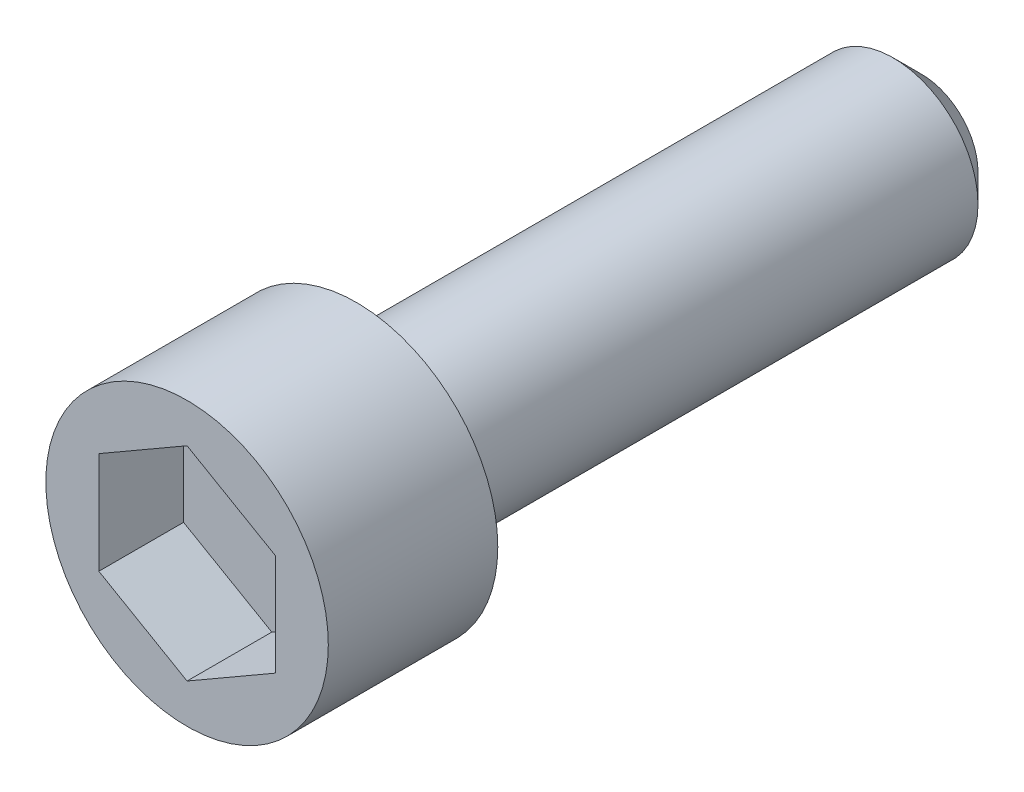
ISO-10303-21;
HEADER;
FILE_DESCRIPTION(('STEP AP214'),'2;1');
FILE_NAME('part.step','',(''),(''),'','','');
FILE_SCHEMA(('AUTOMOTIVE_DESIGN { 1 0 10303 214 1 1 1 1 }'));
ENDSEC;
DATA;
#1=APPLICATION_CONTEXT('core data for automotive mechanical design processes');
#2=APPLICATION_PROTOCOL_DEFINITION('international standard','automotive_design',2000,#1);
#3=PRODUCT_CONTEXT('',#1,'mechanical');
#4=PRODUCT('Part','Part','',(#3));
#5=PRODUCT_RELATED_PRODUCT_CATEGORY('part','',(#4));
#6=PRODUCT_DEFINITION_FORMATION('','',#4);
#7=PRODUCT_DEFINITION_CONTEXT('part definition',#1,'design');
#8=PRODUCT_DEFINITION('design','',#6,#7);
#9=PRODUCT_DEFINITION_SHAPE('','',#8);
#10=(LENGTH_UNIT() NAMED_UNIT(*) SI_UNIT(.MILLI.,.METRE.));
#11=(NAMED_UNIT(*) PLANE_ANGLE_UNIT() SI_UNIT($,.RADIAN.));
#12=(NAMED_UNIT(*) SI_UNIT($,.STERADIAN.) SOLID_ANGLE_UNIT());
#13=UNCERTAINTY_MEASURE_WITH_UNIT(LENGTH_MEASURE(1.E-05),#10,'distance_accuracy_value','');
#14=(GEOMETRIC_REPRESENTATION_CONTEXT(3) GLOBAL_UNCERTAINTY_ASSIGNED_CONTEXT((#13)) GLOBAL_UNIT_ASSIGNED_CONTEXT((#10,
#11,#12)) REPRESENTATION_CONTEXT('',''));
#15=CARTESIAN_POINT('',(0.,0.,0.));
#16=DIRECTION('',(0.,0.,1.));
#17=DIRECTION('',(1.,0.,0.));
#18=AXIS2_PLACEMENT_3D('',#15,#16,#17);
#19=CARTESIAN_POINT('',(0.,0.,10.));
#20=DIRECTION('',(0.,0.,-1.));
#21=DIRECTION('',(-1.,0.,0.));
#22=AXIS2_PLACEMENT_3D('',#19,#20,#21);
#23=CYLINDRICAL_SURFACE('',#22,1.5);
#24=CARTESIAN_POINT('',(0.,0.,0.500000000000002));
#25=DIRECTION('',(0.,0.,1.));
#26=DIRECTION('',(1.,0.,0.));
#27=AXIS2_PLACEMENT_3D('',#24,#25,#26);
#28=CIRCLE('',#27,1.5);
#29=CARTESIAN_POINT('',(1.5,0.,0.500000000000002));
#30=VERTEX_POINT('',#29);
#31=EDGE_CURVE('E44',#30,#30,#28,.T.);
#32=ORIENTED_EDGE('',*,*,#31,.T.);
#33=EDGE_LOOP('',(#32));
#34=FACE_BOUND('',#33,.T.);
#35=CARTESIAN_POINT('',(0.,0.,10.));
#36=DIRECTION('',(0.,0.,1.));
#37=DIRECTION('',(1.,0.,0.));
#38=AXIS2_PLACEMENT_3D('',#35,#36,#37);
#39=CIRCLE('',#38,1.5);
#40=CARTESIAN_POINT('',(1.5,0.,10.));
#41=VERTEX_POINT('',#40);
#42=EDGE_CURVE('E147',#41,#41,#39,.T.);
#43=ORIENTED_EDGE('',*,*,#42,.F.);
#44=EDGE_LOOP('',(#43));
#45=FACE_BOUND('',#44,.T.);
#46=ADVANCED_FACE('F36',(#34,#45),#23,.T.);
#47=CARTESIAN_POINT('',(0.,0.,0.));
#48=DIRECTION('',(0.,0.,1.));
#49=DIRECTION('',(1.,0.,0.));
#50=AXIS2_PLACEMENT_3D('',#47,#48,#49);
#51=PLANE('',#50);
#52=CARTESIAN_POINT('',(0.,0.,0.));
#53=DIRECTION('',(0.,0.,1.));
#54=DIRECTION('',(1.,0.,0.));
#55=AXIS2_PLACEMENT_3D('',#52,#53,#54);
#56=CIRCLE('',#55,0.999999999999999);
#57=CARTESIAN_POINT('',(0.999999999999999,0.,0.));
#58=VERTEX_POINT('',#57);
#59=EDGE_CURVE('E11',#58,#58,#56,.F.);
#60=ORIENTED_EDGE('',*,*,#59,.T.);
#61=EDGE_LOOP('',(#60));
#62=FACE_BOUND('',#61,.T.);
#63=ADVANCED_FACE('F165',(#62),#51,.F.);
#64=CARTESIAN_POINT('',(0.,0.,13.));
#65=DIRECTION('',(0.,0.,-1.));
#66=DIRECTION('',(-1.,0.,0.));
#67=AXIS2_PLACEMENT_3D('',#64,#65,#66);
#68=CYLINDRICAL_SURFACE('',#67,2.5);
#69=CARTESIAN_POINT('',(0.,0.,13.));
#70=DIRECTION('',(0.,0.,1.));
#71=DIRECTION('',(1.,0.,0.));
#72=AXIS2_PLACEMENT_3D('',#69,#70,#71);
#73=CIRCLE('',#72,2.5);
#74=CARTESIAN_POINT('',(2.5,0.,13.));
#75=VERTEX_POINT('',#74);
#76=EDGE_CURVE('E144',#75,#75,#73,.T.);
#77=ORIENTED_EDGE('',*,*,#76,.F.);
#78=EDGE_LOOP('',(#77));
#79=FACE_BOUND('',#78,.T.);
#80=CARTESIAN_POINT('',(0.,0.,10.));
#81=DIRECTION('',(0.,0.,1.));
#82=DIRECTION('',(1.,0.,0.));
#83=AXIS2_PLACEMENT_3D('',#80,#81,#82);
#84=CIRCLE('',#83,2.5);
#85=CARTESIAN_POINT('',(2.5,0.,10.));
#86=VERTEX_POINT('',#85);
#87=EDGE_CURVE('E138',#86,#86,#84,.T.);
#88=ORIENTED_EDGE('',*,*,#87,.T.);
#89=EDGE_LOOP('',(#88));
#90=FACE_BOUND('',#89,.T.);
#91=ADVANCED_FACE('F169',(#79,#90),#68,.T.);
#92=CARTESIAN_POINT('',(0.,0.,13.));
#93=DIRECTION('',(0.,0.,1.));
#94=DIRECTION('',(1.,0.,0.));
#95=AXIS2_PLACEMENT_3D('',#92,#93,#94);
#96=PLANE('',#95);
#97=DIRECTION('',(-0.866025403784442,0.499999999999995,0.));
#98=VECTOR('',#97,1.);
#99=CARTESIAN_POINT('',(1.56177486979958,0.901691141492407,13.));
#100=LINE('',#99,#98);
#101=CARTESIAN_POINT('',(1.56177486979958,0.901691141492407,13.));
#102=VERTEX_POINT('',#101);
#103=CARTESIAN_POINT('',(0.,1.80338228298478,13.));
#104=VERTEX_POINT('',#103);
#105=EDGE_CURVE('E51',#102,#104,#100,.T.);
#106=ORIENTED_EDGE('',*,*,#105,.F.);
#107=DIRECTION('',(0.,1.,0.));
#108=VECTOR('',#107,1.);
#109=CARTESIAN_POINT('',(1.5617748697996,-0.901691141492374,13.));
#110=LINE('',#109,#108);
#111=CARTESIAN_POINT('',(1.5617748697996,-0.901691141492374,13.));
#112=VERTEX_POINT('',#111);
#113=EDGE_CURVE('E134',#112,#102,#110,.T.);
#114=ORIENTED_EDGE('',*,*,#113,.F.);
#115=DIRECTION('',(0.866025403784435,0.500000000000007,0.));
#116=VECTOR('',#115,1.);
#117=CARTESIAN_POINT('',(0.,-1.80338228298478,13.));
#118=LINE('',#117,#116);
#119=CARTESIAN_POINT('',(0.,-1.80338228298478,13.));
#120=VERTEX_POINT('',#119);
#121=EDGE_CURVE('E132',#120,#112,#118,.T.);
#122=ORIENTED_EDGE('',*,*,#121,.F.);
#123=DIRECTION('',(0.866025403784441,-0.499999999999995,0.));
#124=VECTOR('',#123,1.);
#125=CARTESIAN_POINT('',(-1.56177486979959,-0.901691141492395,13.));
#126=LINE('',#125,#124);
#127=CARTESIAN_POINT('',(-1.56177486979959,-0.901691141492395,13.));
#128=VERTEX_POINT('',#127);
#129=EDGE_CURVE('E99',#128,#120,#126,.T.);
#130=ORIENTED_EDGE('',*,*,#129,.F.);
#131=DIRECTION('',(0.,-1.,0.));
#132=VECTOR('',#131,1.);
#133=CARTESIAN_POINT('',(-1.5617748697996,0.901691141492385,13.));
#134=LINE('',#133,#132);
#135=CARTESIAN_POINT('',(-1.5617748697996,0.901691141492385,13.));
#136=VERTEX_POINT('',#135);
#137=EDGE_CURVE('E128',#136,#128,#134,.T.);
#138=ORIENTED_EDGE('',*,*,#137,.F.);
#139=DIRECTION('',(-0.866025403784438,-0.500000000000001,0.));
#140=VECTOR('',#139,1.);
#141=CARTESIAN_POINT('',(0.,1.80338228298478,13.));
#142=LINE('',#141,#140);
#143=EDGE_CURVE('E125',#104,#136,#142,.T.);
#144=ORIENTED_EDGE('',*,*,#143,.F.);
#145=EDGE_LOOP('',(#106,#114,#122,#130,#138,#144));
#146=FACE_BOUND('',#145,.T.);
#147=ORIENTED_EDGE('',*,*,#76,.T.);
#148=EDGE_LOOP('',(#147));
#149=FACE_BOUND('',#148,.T.);
#150=ADVANCED_FACE('F175',(#146,#149),#96,.T.);
#151=CARTESIAN_POINT('',(0.,0.,10.));
#152=DIRECTION('',(0.,0.,1.));
#153=DIRECTION('',(1.,0.,0.));
#154=AXIS2_PLACEMENT_3D('',#151,#152,#153);
#155=PLANE('',#154);
#156=ORIENTED_EDGE('',*,*,#42,.T.);
#157=EDGE_LOOP('',(#156));
#158=FACE_BOUND('',#157,.T.);
#159=ORIENTED_EDGE('',*,*,#87,.F.);
#160=EDGE_LOOP('',(#159));
#161=FACE_BOUND('',#160,.T.);
#162=ADVANCED_FACE('F177',(#158,#161),#155,.F.);
#163=CARTESIAN_POINT('',(1.56177486979958,0.901691141492407,11.5));
#164=DIRECTION('',(0.499999999999995,0.866025403784441,0.));
#165=DIRECTION('',(-0.866025403784442,0.499999999999995,0.));
#166=AXIS2_PLACEMENT_3D('',#163,#164,#165);
#167=PLANE('',#166);
#168=ORIENTED_EDGE('',*,*,#105,.T.);
#169=DIRECTION('',(0.,0.,1.));
#170=VECTOR('',#169,1.);
#171=CARTESIAN_POINT('',(0.,1.80338228298478,11.5));
#172=LINE('',#171,#170);
#173=CARTESIAN_POINT('',(0.,1.80338228298478,11.5));
#174=VERTEX_POINT('',#173);
#175=EDGE_CURVE('E81',#174,#104,#172,.T.);
#176=ORIENTED_EDGE('',*,*,#175,.F.);
#177=DIRECTION('',(-0.866025403784442,0.499999999999995,0.));
#178=VECTOR('',#177,1.);
#179=CARTESIAN_POINT('',(1.56177486979958,0.901691141492407,11.5));
#180=LINE('',#179,#178);
#181=CARTESIAN_POINT('',(1.56177486979958,0.901691141492407,11.5));
#182=VERTEX_POINT('',#181);
#183=EDGE_CURVE('E136',#182,#174,#180,.T.);
#184=ORIENTED_EDGE('',*,*,#183,.F.);
#185=DIRECTION('',(0.,0.,1.));
#186=VECTOR('',#185,1.);
#187=CARTESIAN_POINT('',(1.56177486979958,0.901691141492407,11.5));
#188=LINE('',#187,#186);
#189=EDGE_CURVE('E59',#182,#102,#188,.T.);
#190=ORIENTED_EDGE('',*,*,#189,.T.);
#191=EDGE_LOOP('',(#168,#176,#184,#190));
#192=FACE_BOUND('',#191,.T.);
#193=ADVANCED_FACE('F180',(#192),#167,.F.);
#194=CARTESIAN_POINT('',(1.5617748697996,-0.901691141492374,11.5));
#195=DIRECTION('',(1.,0.,0.));
#196=DIRECTION('',(0.,1.,0.));
#197=AXIS2_PLACEMENT_3D('',#194,#195,#196);
#198=PLANE('',#197);
#199=ORIENTED_EDGE('',*,*,#113,.T.);
#200=ORIENTED_EDGE('',*,*,#189,.F.);
#201=DIRECTION('',(0.,1.,0.));
#202=VECTOR('',#201,1.);
#203=CARTESIAN_POINT('',(1.5617748697996,-0.901691141492374,11.5));
#204=LINE('',#203,#202);
#205=CARTESIAN_POINT('',(1.5617748697996,-0.901691141492374,11.5));
#206=VERTEX_POINT('',#205);
#207=EDGE_CURVE('E111',#206,#182,#204,.T.);
#208=ORIENTED_EDGE('',*,*,#207,.F.);
#209=DIRECTION('',(0.,0.,1.));
#210=VECTOR('',#209,1.);
#211=CARTESIAN_POINT('',(1.5617748697996,-0.901691141492374,11.5));
#212=LINE('',#211,#210);
#213=EDGE_CURVE('E103',#206,#112,#212,.T.);
#214=ORIENTED_EDGE('',*,*,#213,.T.);
#215=EDGE_LOOP('',(#199,#200,#208,#214));
#216=FACE_BOUND('',#215,.T.);
#217=ADVANCED_FACE('F187',(#216),#198,.F.);
#218=CARTESIAN_POINT('',(0.,-1.80338228298478,11.5));
#219=DIRECTION('',(0.500000000000007,-0.866025403784435,0.));
#220=DIRECTION('',(0.866025403784434,0.500000000000007,0.));
#221=AXIS2_PLACEMENT_3D('',#218,#219,#220);
#222=PLANE('',#221);
#223=ORIENTED_EDGE('',*,*,#121,.T.);
#224=ORIENTED_EDGE('',*,*,#213,.F.);
#225=DIRECTION('',(0.866025403784435,0.500000000000007,0.));
#226=VECTOR('',#225,1.);
#227=CARTESIAN_POINT('',(0.,-1.80338228298478,11.5));
#228=LINE('',#227,#226);
#229=CARTESIAN_POINT('',(0.,-1.80338228298478,11.5));
#230=VERTEX_POINT('',#229);
#231=EDGE_CURVE('E107',#230,#206,#228,.T.);
#232=ORIENTED_EDGE('',*,*,#231,.F.);
#233=DIRECTION('',(0.,0.,1.));
#234=VECTOR('',#233,1.);
#235=CARTESIAN_POINT('',(0.,-1.80338228298478,11.5));
#236=LINE('',#235,#234);
#237=EDGE_CURVE('E92',#230,#120,#236,.T.);
#238=ORIENTED_EDGE('',*,*,#237,.T.);
#239=EDGE_LOOP('',(#223,#224,#232,#238));
#240=FACE_BOUND('',#239,.T.);
#241=ADVANCED_FACE('F108',(#240),#222,.F.);
#242=CARTESIAN_POINT('',(-1.56177486979959,-0.901691141492395,11.5));
#243=DIRECTION('',(-0.499999999999995,-0.866025403784441,0.));
#244=DIRECTION('',(0.866025403784442,-0.499999999999995,0.));
#245=AXIS2_PLACEMENT_3D('',#242,#243,#244);
#246=PLANE('',#245);
#247=ORIENTED_EDGE('',*,*,#129,.T.);
#248=ORIENTED_EDGE('',*,*,#237,.F.);
#249=DIRECTION('',(0.866025403784441,-0.499999999999995,0.));
#250=VECTOR('',#249,1.);
#251=CARTESIAN_POINT('',(-1.56177486979959,-0.901691141492395,11.5));
#252=LINE('',#251,#250);
#253=CARTESIAN_POINT('',(-1.56177486979959,-0.901691141492395,11.5));
#254=VERTEX_POINT('',#253);
#255=EDGE_CURVE('E96',#254,#230,#252,.T.);
#256=ORIENTED_EDGE('',*,*,#255,.F.);
#257=DIRECTION('',(0.,0.,1.));
#258=VECTOR('',#257,1.);
#259=CARTESIAN_POINT('',(-1.56177486979959,-0.901691141492395,11.5));
#260=LINE('',#259,#258);
#261=EDGE_CURVE('E104',#254,#128,#260,.T.);
#262=ORIENTED_EDGE('',*,*,#261,.T.);
#263=EDGE_LOOP('',(#247,#248,#256,#262));
#264=FACE_BOUND('',#263,.T.);
#265=ADVANCED_FACE('F94',(#264),#246,.F.);
#266=CARTESIAN_POINT('',(-1.5617748697996,0.901691141492385,11.5));
#267=DIRECTION('',(-1.,0.,0.));
#268=DIRECTION('',(0.,-1.,0.));
#269=AXIS2_PLACEMENT_3D('',#266,#267,#268);
#270=PLANE('',#269);
#271=ORIENTED_EDGE('',*,*,#137,.T.);
#272=ORIENTED_EDGE('',*,*,#261,.F.);
#273=DIRECTION('',(0.,-1.,0.));
#274=VECTOR('',#273,1.);
#275=CARTESIAN_POINT('',(-1.5617748697996,0.901691141492385,11.5));
#276=LINE('',#275,#274);
#277=CARTESIAN_POINT('',(-1.5617748697996,0.901691141492385,11.5));
#278=VERTEX_POINT('',#277);
#279=EDGE_CURVE('E117',#278,#254,#276,.T.);
#280=ORIENTED_EDGE('',*,*,#279,.F.);
#281=DIRECTION('',(0.,0.,1.));
#282=VECTOR('',#281,1.);
#283=CARTESIAN_POINT('',(-1.5617748697996,0.901691141492385,11.5));
#284=LINE('',#283,#282);
#285=EDGE_CURVE('E141',#278,#136,#284,.T.);
#286=ORIENTED_EDGE('',*,*,#285,.T.);
#287=EDGE_LOOP('',(#271,#272,#280,#286));
#288=FACE_BOUND('',#287,.T.);
#289=ADVANCED_FACE('F190',(#288),#270,.F.);
#290=CARTESIAN_POINT('',(0.,1.80338228298478,11.5));
#291=DIRECTION('',(-0.500000000000001,0.866025403784438,0.));
#292=DIRECTION('',(-0.866025403784438,-0.500000000000001,0.));
#293=AXIS2_PLACEMENT_3D('',#290,#291,#292);
#294=PLANE('',#293);
#295=ORIENTED_EDGE('',*,*,#143,.T.);
#296=ORIENTED_EDGE('',*,*,#285,.F.);
#297=DIRECTION('',(-0.866025403784438,-0.500000000000001,0.));
#298=VECTOR('',#297,1.);
#299=CARTESIAN_POINT('',(0.,1.80338228298478,11.5));
#300=LINE('',#299,#298);
#301=EDGE_CURVE('E119',#174,#278,#300,.T.);
#302=ORIENTED_EDGE('',*,*,#301,.F.);
#303=ORIENTED_EDGE('',*,*,#175,.T.);
#304=EDGE_LOOP('',(#295,#296,#302,#303));
#305=FACE_BOUND('',#304,.T.);
#306=ADVANCED_FACE('F161',(#305),#294,.F.);
#307=CARTESIAN_POINT('',(0.,0.,11.5));
#308=DIRECTION('',(0.,0.,1.));
#309=DIRECTION('',(1.,0.,0.));
#310=AXIS2_PLACEMENT_3D('',#307,#308,#309);
#311=PLANE('',#310);
#312=ORIENTED_EDGE('',*,*,#183,.T.);
#313=ORIENTED_EDGE('',*,*,#301,.T.);
#314=ORIENTED_EDGE('',*,*,#279,.T.);
#315=ORIENTED_EDGE('',*,*,#255,.T.);
#316=ORIENTED_EDGE('',*,*,#231,.T.);
#317=ORIENTED_EDGE('',*,*,#207,.T.);
#318=EDGE_LOOP('',(#312,#313,#314,#315,#316,#317));
#319=FACE_BOUND('',#318,.T.);
#320=ADVANCED_FACE('F114',(#319),#311,.T.);
#321=CARTESIAN_POINT('',(0.,0.,0.500000000000002));
#322=DIRECTION('',(0.,0.,1.));
#323=DIRECTION('',(1.,0.,0.));
#324=AXIS2_PLACEMENT_3D('',#321,#322,#323);
#325=CONICAL_SURFACE('',#324,1.5,0.785398163397448);
#326=ORIENTED_EDGE('',*,*,#59,.F.);
#327=EDGE_LOOP('',(#326));
#328=FACE_BOUND('',#327,.T.);
#329=ORIENTED_EDGE('',*,*,#31,.F.);
#330=EDGE_LOOP('',(#329));
#331=FACE_BOUND('',#330,.T.);
#332=ADVANCED_FACE('F38',(#328,#331),#325,.T.);
#333=CLOSED_SHELL('',(#46,#63,#91,#150,#162,#193,#217,#241,#265,#289,#306,#320,#332));
#334=MANIFOLD_SOLID_BREP('B2',#333);
#335=ADVANCED_BREP_SHAPE_REPRESENTATION('',(#18,#334),#14);
#336=SHAPE_DEFINITION_REPRESENTATION(#9,#335);
ENDSEC;
END-ISO-10303-21;
